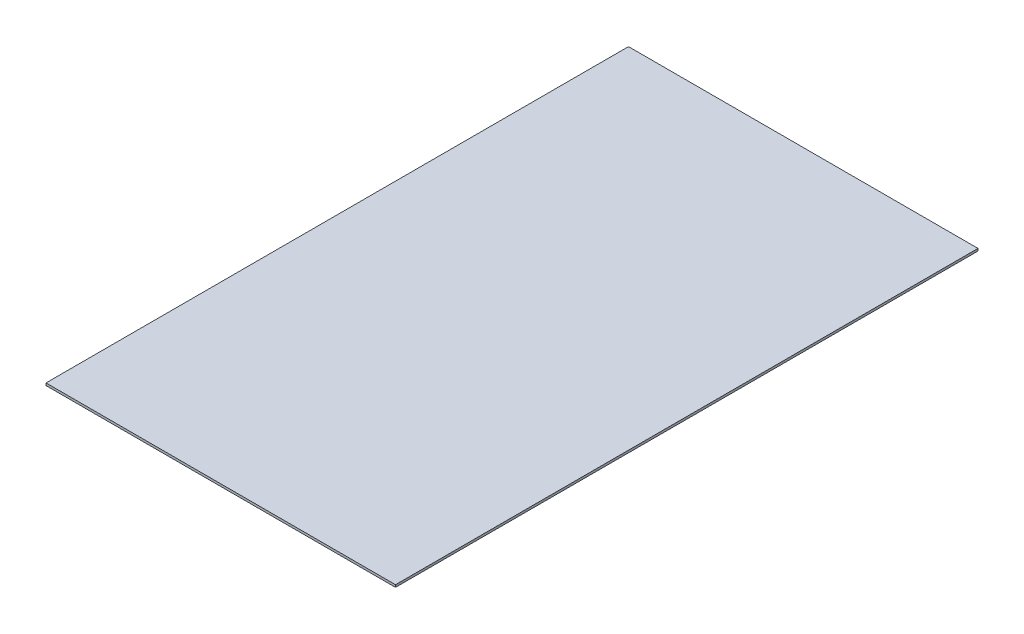
ISO-10303-21;
HEADER;
FILE_DESCRIPTION(('STEP AP214'),'2;1');
FILE_NAME('part.step','',(''),(''),'','','');
FILE_SCHEMA(('AUTOMOTIVE_DESIGN { 1 0 10303 214 1 1 1 1 }'));
ENDSEC;
DATA;
#1=APPLICATION_CONTEXT('core data for automotive mechanical design processes');
#2=APPLICATION_PROTOCOL_DEFINITION('international standard','automotive_design',2000,#1);
#3=PRODUCT_CONTEXT('',#1,'mechanical');
#4=PRODUCT('Part','Part','',(#3));
#5=PRODUCT_RELATED_PRODUCT_CATEGORY('part','',(#4));
#6=PRODUCT_DEFINITION_FORMATION('','',#4);
#7=PRODUCT_DEFINITION_CONTEXT('part definition',#1,'design');
#8=PRODUCT_DEFINITION('design','',#6,#7);
#9=PRODUCT_DEFINITION_SHAPE('','',#8);
#10=(LENGTH_UNIT() NAMED_UNIT(*) SI_UNIT(.MILLI.,.METRE.));
#11=(NAMED_UNIT(*) PLANE_ANGLE_UNIT() SI_UNIT($,.RADIAN.));
#12=(NAMED_UNIT(*) SI_UNIT($,.STERADIAN.) SOLID_ANGLE_UNIT());
#13=UNCERTAINTY_MEASURE_WITH_UNIT(LENGTH_MEASURE(1.E-05),#10,'distance_accuracy_value','');
#14=(GEOMETRIC_REPRESENTATION_CONTEXT(3) GLOBAL_UNCERTAINTY_ASSIGNED_CONTEXT((#13)) GLOBAL_UNIT_ASSIGNED_CONTEXT((#10,
#11,#12)) REPRESENTATION_CONTEXT('',''));
#15=CARTESIAN_POINT('',(0.,0.,0.));
#16=DIRECTION('',(0.,0.,1.));
#17=DIRECTION('',(1.,0.,0.));
#18=AXIS2_PLACEMENT_3D('',#15,#16,#17);
#19=CARTESIAN_POINT('',(0.,0.2,0.));
#20=DIRECTION('',(-1.,0.,0.));
#21=DIRECTION('',(0.,0.,1.));
#22=AXIS2_PLACEMENT_3D('',#19,#20,#21);
#23=PLANE('',#22);
#24=DIRECTION('',(0.,0.,-1.));
#25=VECTOR('',#24,1.);
#26=CARTESIAN_POINT('',(0.,0.,0.));
#27=LINE('',#26,#25);
#28=CARTESIAN_POINT('',(0.,0.,0.));
#29=VERTEX_POINT('',#28);
#30=CARTESIAN_POINT('',(0.,0.,-50.));
#31=VERTEX_POINT('',#30);
#32=EDGE_CURVE('E96',#29,#31,#27,.T.);
#33=ORIENTED_EDGE('',*,*,#32,.T.);
#34=DIRECTION('',(0.,-1.,0.));
#35=VECTOR('',#34,1.);
#36=CARTESIAN_POINT('',(0.,0.2,-50.));
#37=LINE('',#36,#35);
#38=CARTESIAN_POINT('',(0.,0.2,-50.));
#39=VERTEX_POINT('',#38);
#40=EDGE_CURVE('E11',#39,#31,#37,.T.);
#41=ORIENTED_EDGE('',*,*,#40,.F.);
#42=DIRECTION('',(0.,0.,-1.));
#43=VECTOR('',#42,1.);
#44=CARTESIAN_POINT('',(0.,0.2,0.));
#45=LINE('',#44,#43);
#46=CARTESIAN_POINT('',(0.,0.2,0.));
#47=VERTEX_POINT('',#46);
#48=EDGE_CURVE('E84',#47,#39,#45,.T.);
#49=ORIENTED_EDGE('',*,*,#48,.F.);
#50=DIRECTION('',(0.,-1.,0.));
#51=VECTOR('',#50,1.);
#52=CARTESIAN_POINT('',(0.,0.2,0.));
#53=LINE('',#52,#51);
#54=EDGE_CURVE('E92',#47,#29,#53,.T.);
#55=ORIENTED_EDGE('',*,*,#54,.T.);
#56=EDGE_LOOP('',(#33,#41,#49,#55));
#57=FACE_BOUND('',#56,.T.);
#58=ADVANCED_FACE('F33',(#57),#23,.F.);
#59=CARTESIAN_POINT('',(0.,0.2,-50.));
#60=DIRECTION('',(0.,0.,1.));
#61=DIRECTION('',(1.,0.,0.));
#62=AXIS2_PLACEMENT_3D('',#59,#60,#61);
#63=PLANE('',#62);
#64=DIRECTION('',(-1.,0.,0.));
#65=VECTOR('',#64,1.);
#66=CARTESIAN_POINT('',(0.,0.,-50.));
#67=LINE('',#66,#65);
#68=CARTESIAN_POINT('',(-30.,0.,-50.));
#69=VERTEX_POINT('',#68);
#70=EDGE_CURVE('E88',#31,#69,#67,.T.);
#71=ORIENTED_EDGE('',*,*,#70,.T.);
#72=DIRECTION('',(0.,-1.,0.));
#73=VECTOR('',#72,1.);
#74=CARTESIAN_POINT('',(-30.,0.2,-50.));
#75=LINE('',#74,#73);
#76=CARTESIAN_POINT('',(-30.,0.2,-50.));
#77=VERTEX_POINT('',#76);
#78=EDGE_CURVE('E41',#77,#69,#75,.T.);
#79=ORIENTED_EDGE('',*,*,#78,.F.);
#80=DIRECTION('',(-1.,0.,0.));
#81=VECTOR('',#80,1.);
#82=CARTESIAN_POINT('',(0.,0.2,-50.));
#83=LINE('',#82,#81);
#84=EDGE_CURVE('E79',#39,#77,#83,.T.);
#85=ORIENTED_EDGE('',*,*,#84,.F.);
#86=ORIENTED_EDGE('',*,*,#40,.T.);
#87=EDGE_LOOP('',(#71,#79,#85,#86));
#88=FACE_BOUND('',#87,.T.);
#89=ADVANCED_FACE('F87',(#88),#63,.F.);
#90=CARTESIAN_POINT('',(-30.,0.2,0.));
#91=DIRECTION('',(1.,0.,0.));
#92=DIRECTION('',(0.,0.,-1.));
#93=AXIS2_PLACEMENT_3D('',#90,#91,#92);
#94=PLANE('',#93);
#95=DIRECTION('',(0.,0.,1.));
#96=VECTOR('',#95,1.);
#97=CARTESIAN_POINT('',(-30.,0.,0.));
#98=LINE('',#97,#96);
#99=CARTESIAN_POINT('',(-30.,0.,0.));
#100=VERTEX_POINT('',#99);
#101=EDGE_CURVE('E66',#69,#100,#98,.T.);
#102=ORIENTED_EDGE('',*,*,#101,.T.);
#103=DIRECTION('',(0.,-1.,0.));
#104=VECTOR('',#103,1.);
#105=CARTESIAN_POINT('',(-30.,0.2,0.));
#106=LINE('',#105,#104);
#107=CARTESIAN_POINT('',(-30.,0.2,0.));
#108=VERTEX_POINT('',#107);
#109=EDGE_CURVE('E89',#108,#100,#106,.T.);
#110=ORIENTED_EDGE('',*,*,#109,.F.);
#111=DIRECTION('',(0.,0.,1.));
#112=VECTOR('',#111,1.);
#113=CARTESIAN_POINT('',(-30.,0.2,0.));
#114=LINE('',#113,#112);
#115=EDGE_CURVE('E82',#77,#108,#114,.T.);
#116=ORIENTED_EDGE('',*,*,#115,.F.);
#117=ORIENTED_EDGE('',*,*,#78,.T.);
#118=EDGE_LOOP('',(#102,#110,#116,#117));
#119=FACE_BOUND('',#118,.T.);
#120=ADVANCED_FACE('F90',(#119),#94,.F.);
#121=CARTESIAN_POINT('',(0.,0.2,0.));
#122=DIRECTION('',(0.,0.,-1.));
#123=DIRECTION('',(-1.,0.,0.));
#124=AXIS2_PLACEMENT_3D('',#121,#122,#123);
#125=PLANE('',#124);
#126=DIRECTION('',(1.,0.,0.));
#127=VECTOR('',#126,1.);
#128=CARTESIAN_POINT('',(0.,0.,0.));
#129=LINE('',#128,#127);
#130=EDGE_CURVE('E72',#100,#29,#129,.T.);
#131=ORIENTED_EDGE('',*,*,#130,.T.);
#132=ORIENTED_EDGE('',*,*,#54,.F.);
#133=DIRECTION('',(1.,0.,0.));
#134=VECTOR('',#133,1.);
#135=CARTESIAN_POINT('',(0.,0.2,0.));
#136=LINE('',#135,#134);
#137=EDGE_CURVE('E49',#108,#47,#136,.T.);
#138=ORIENTED_EDGE('',*,*,#137,.F.);
#139=ORIENTED_EDGE('',*,*,#109,.T.);
#140=EDGE_LOOP('',(#131,#132,#138,#139));
#141=FACE_BOUND('',#140,.T.);
#142=ADVANCED_FACE('F103',(#141),#125,.F.);
#143=CARTESIAN_POINT('',(0.,0.2,0.));
#144=DIRECTION('',(0.,1.,0.));
#145=DIRECTION('',(0.,0.,1.));
#146=AXIS2_PLACEMENT_3D('',#143,#144,#145);
#147=PLANE('',#146);
#148=ORIENTED_EDGE('',*,*,#48,.T.);
#149=ORIENTED_EDGE('',*,*,#84,.T.);
#150=ORIENTED_EDGE('',*,*,#115,.T.);
#151=ORIENTED_EDGE('',*,*,#137,.T.);
#152=EDGE_LOOP('',(#148,#149,#150,#151));
#153=FACE_BOUND('',#152,.T.);
#154=ADVANCED_FACE('F80',(#153),#147,.T.);
#155=CARTESIAN_POINT('',(0.,0.,0.));
#156=DIRECTION('',(0.,1.,0.));
#157=DIRECTION('',(0.,0.,1.));
#158=AXIS2_PLACEMENT_3D('',#155,#156,#157);
#159=PLANE('',#158);
#160=ORIENTED_EDGE('',*,*,#32,.F.);
#161=ORIENTED_EDGE('',*,*,#130,.F.);
#162=ORIENTED_EDGE('',*,*,#101,.F.);
#163=ORIENTED_EDGE('',*,*,#70,.F.);
#164=EDGE_LOOP('',(#160,#161,#162,#163));
#165=FACE_BOUND('',#164,.T.);
#166=ADVANCED_FACE('F106',(#165),#159,.F.);
#167=CLOSED_SHELL('',(#58,#89,#120,#142,#154,#166));
#168=MANIFOLD_SOLID_BREP('B2',#167);
#169=ADVANCED_BREP_SHAPE_REPRESENTATION('',(#18,#168),#14);
#170=SHAPE_DEFINITION_REPRESENTATION(#9,#169);
ENDSEC;
END-ISO-10303-21;
